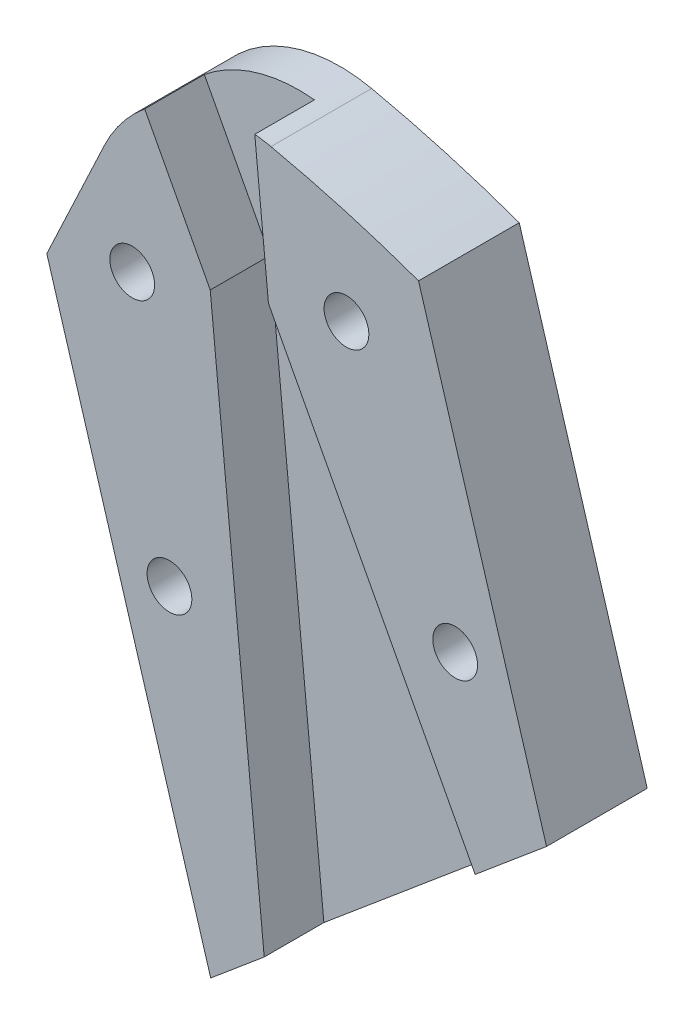
ISO-10303-21;
HEADER;
FILE_DESCRIPTION(('STEP AP214'),'2;1');
FILE_NAME('part.step','',(''),(''),'','','');
FILE_SCHEMA(('AUTOMOTIVE_DESIGN { 1 0 10303 214 1 1 1 1 }'));
ENDSEC;
DATA;
#1=APPLICATION_CONTEXT('core data for automotive mechanical design processes');
#2=APPLICATION_PROTOCOL_DEFINITION('international standard','automotive_design',2000,#1);
#3=PRODUCT_CONTEXT('',#1,'mechanical');
#4=PRODUCT('Part','Part','',(#3));
#5=PRODUCT_RELATED_PRODUCT_CATEGORY('part','',(#4));
#6=PRODUCT_DEFINITION_FORMATION('','',#4);
#7=PRODUCT_DEFINITION_CONTEXT('part definition',#1,'design');
#8=PRODUCT_DEFINITION('design','',#6,#7);
#9=PRODUCT_DEFINITION_SHAPE('','',#8);
#10=(LENGTH_UNIT() NAMED_UNIT(*) SI_UNIT(.MILLI.,.METRE.));
#11=(NAMED_UNIT(*) PLANE_ANGLE_UNIT() SI_UNIT($,.RADIAN.));
#12=(NAMED_UNIT(*) SI_UNIT($,.STERADIAN.) SOLID_ANGLE_UNIT());
#13=UNCERTAINTY_MEASURE_WITH_UNIT(LENGTH_MEASURE(1.E-05),#10,'distance_accuracy_value','');
#14=(GEOMETRIC_REPRESENTATION_CONTEXT(3) GLOBAL_UNCERTAINTY_ASSIGNED_CONTEXT((#13)) GLOBAL_UNIT_ASSIGNED_CONTEXT((#10,
#11,#12)) REPRESENTATION_CONTEXT('',''));
#15=CARTESIAN_POINT('',(0.,0.,0.));
#16=DIRECTION('',(0.,0.,1.));
#17=DIRECTION('',(1.,0.,0.));
#18=AXIS2_PLACEMENT_3D('',#15,#16,#17);
#19=CARTESIAN_POINT('',(-74.1892847970259,-68.5571228840362,-27.5));
#20=DIRECTION('',(0.,0.,1.));
#21=DIRECTION('',(-1.,0.,0.));
#22=AXIS2_PLACEMENT_3D('',#19,#20,#21);
#23=PLANE('',#22);
#24=CARTESIAN_POINT('',(-101.219347978572,42.2429052887889,-27.5));
#25=DIRECTION('',(0.,0.,-1.));
#26=DIRECTION('',(-1.,0.,0.));
#27=AXIS2_PLACEMENT_3D('',#24,#25,#26);
#28=CIRCLE('',#27,1.5);
#29=CARTESIAN_POINT('',(-102.719347978572,42.2429052887889,-27.5));
#30=VERTEX_POINT('',#29);
#31=EDGE_CURVE('E198',#30,#30,#28,.F.);
#32=ORIENTED_EDGE('',*,*,#31,.F.);
#33=EDGE_LOOP('',(#32));
#34=FACE_BOUND('',#33,.T.);
#35=DIRECTION('',(0.0975753561358641,-0.995228139611697,0.));
#36=VECTOR('',#35,1.);
#37=CARTESIAN_POINT('',(-90.8199749610443,-8.90428138871929,-27.5));
#38=LINE('',#37,#36);
#39=CARTESIAN_POINT('',(-95.9887125382994,43.814696915495,-27.5));
#40=VERTEX_POINT('',#39);
#41=CARTESIAN_POINT('',(-92.3690173131185,6.89530776254084,-27.5));
#42=VERTEX_POINT('',#41);
#43=EDGE_CURVE('E163',#40,#42,#38,.T.);
#44=ORIENTED_EDGE('',*,*,#43,.F.);
#45=DIRECTION('',(0.46717680987291,-0.884163914846659,0.));
#46=VECTOR('',#45,1.);
#47=CARTESIAN_POINT('',(-56.9406384526719,-30.0864414140442,-27.5));
#48=LINE('',#47,#46);
#49=CARTESIAN_POINT('',(-100.382341665289,52.1299391261703,-27.5));
#50=VERTEX_POINT('',#49);
#51=EDGE_CURVE('E42',#50,#40,#48,.T.);
#52=ORIENTED_EDGE('',*,*,#51,.F.);
#53=CARTESIAN_POINT('',(-94.0366346201967,44.4012909844925,-27.5));
#54=DIRECTION('',(0.,0.,-1.));
#55=DIRECTION('',(-1.,0.,0.));
#56=AXIS2_PLACEMENT_3D('',#53,#54,#55);
#57=CIRCLE('',#56,9.99999999999999);
#58=CARTESIAN_POINT('',(-103.085929893281,48.6569055183213,-27.5));
#59=VERTEX_POINT('',#58);
#60=EDGE_CURVE('E150',#59,#50,#57,.T.);
#61=ORIENTED_EDGE('',*,*,#60,.F.);
#62=DIRECTION('',(-0.425561453382882,-0.904929527308425,0.));
#63=VECTOR('',#62,1.);
#64=CARTESIAN_POINT('',(-103.154731418742,48.5106034239492,-27.5));
#65=LINE('',#64,#63);
#66=CARTESIAN_POINT('',(-106.945535827358,40.4496974975837,-27.5));
#67=VERTEX_POINT('',#66);
#68=EDGE_CURVE('E207',#59,#67,#65,.T.);
#69=ORIENTED_EDGE('',*,*,#68,.T.);
#70=DIRECTION('',(-0.287784759427187,0.95769511445002,0.));
#71=VECTOR('',#70,1.);
#72=CARTESIAN_POINT('',(-74.1892847970259,-68.5571228840362,-27.5));
#73=LINE('',#72,#71);
#74=CARTESIAN_POINT('',(-95.9576660688243,3.88407391520334,-27.5));
#75=VERTEX_POINT('',#74);
#76=EDGE_CURVE('E11',#75,#67,#73,.T.);
#77=ORIENTED_EDGE('',*,*,#76,.F.);
#78=DIRECTION('',(-0.766044443118982,-0.642787609686535,0.));
#79=VECTOR('',#78,1.);
#80=CARTESIAN_POINT('',(-41.5599291638824,49.5291948890183,-27.5));
#81=LINE('',#80,#79);
#82=EDGE_CURVE('E190',#42,#75,#81,.T.);
#83=ORIENTED_EDGE('',*,*,#82,.F.);
#84=EDGE_LOOP('',(#44,#52,#61,#69,#77,#83));
#85=FACE_BOUND('',#84,.T.);
#86=CARTESIAN_POINT('',(-98.7212448544347,25.2426264445703,-27.5));
#87=DIRECTION('',(0.,0.,-1.));
#88=DIRECTION('',(-1.,0.,0.));
#89=AXIS2_PLACEMENT_3D('',#86,#87,#88);
#90=CIRCLE('',#89,1.5);
#91=CARTESIAN_POINT('',(-100.221244854435,25.2426264445703,-27.5));
#92=VERTEX_POINT('',#91);
#93=EDGE_CURVE('E157',#92,#92,#90,.F.);
#94=ORIENTED_EDGE('',*,*,#93,.F.);
#95=EDGE_LOOP('',(#94));
#96=FACE_BOUND('',#95,.T.);
#97=ADVANCED_FACE('F38',(#34,#85,#96),#23,.T.);
#98=CARTESIAN_POINT('',(-74.1892847970259,-68.5571228840362,-27.5));
#99=DIRECTION('',(-0.95769511445002,-0.287784759427187,0.));
#100=DIRECTION('',(0.287784759427187,-0.95769511445002,0.));
#101=AXIS2_PLACEMENT_3D('',#98,#99,#100);
#102=PLANE('',#101);
#103=ORIENTED_EDGE('',*,*,#76,.T.);
#104=DIRECTION('',(0.,0.,-1.));
#105=VECTOR('',#104,1.);
#106=CARTESIAN_POINT('',(-106.945535827358,40.4496974975837,-34.25));
#107=LINE('',#106,#105);
#108=CARTESIAN_POINT('',(-106.945535827358,40.4496974975837,-34.25));
#109=VERTEX_POINT('',#108);
#110=EDGE_CURVE('E209',#67,#109,#107,.T.);
#111=ORIENTED_EDGE('',*,*,#110,.T.);
#112=DIRECTION('',(0.287784759427187,-0.95769511445002,0.));
#113=VECTOR('',#112,1.);
#114=CARTESIAN_POINT('',(-86.9399558255523,-26.1252186571247,-34.25));
#115=LINE('',#114,#113);
#116=CARTESIAN_POINT('',(-95.9576660688243,3.88407391520334,-34.25));
#117=VERTEX_POINT('',#116);
#118=EDGE_CURVE('E183',#109,#117,#115,.T.);
#119=ORIENTED_EDGE('',*,*,#118,.T.);
#120=DIRECTION('',(0.,0.,-1.));
#121=VECTOR('',#120,1.);
#122=CARTESIAN_POINT('',(-95.9576660688243,3.88407391520334,-34.25));
#123=LINE('',#122,#121);
#124=EDGE_CURVE('E187',#75,#117,#123,.T.);
#125=ORIENTED_EDGE('',*,*,#124,.F.);
#126=EDGE_LOOP('',(#103,#111,#119,#125));
#127=FACE_BOUND('',#126,.T.);
#128=ADVANCED_FACE('F299',(#127),#102,.T.);
#129=CARTESIAN_POINT('',(-79.5673425654343,30.998321633114,-27.5));
#130=DIRECTION('',(0.,0.,-1.));
#131=DIRECTION('',(-1.,0.,0.));
#132=AXIS2_PLACEMENT_3D('',#129,#130,#131);
#133=CIRCLE('',#132,1.5);
#134=CARTESIAN_POINT('',(-81.0673425654343,30.998321633114,-27.5));
#135=VERTEX_POINT('',#134);
#136=EDGE_CURVE('E204',#135,#135,#133,.F.);
#137=ORIENTED_EDGE('',*,*,#136,.F.);
#138=EDGE_LOOP('',(#137));
#139=FACE_BOUND('',#138,.T.);
#140=DIRECTION('',(-0.287784759427187,0.95769511445002,0.));
#141=VECTOR('',#140,1.);
#142=CARTESIAN_POINT('',(-48.3315167068753,-60.7869343795021,-27.5));
#143=LINE('',#142,#141);
#144=CARTESIAN_POINT('',(-73.4421904308482,22.7768012188099,-27.5));
#145=VERTEX_POINT('',#144);
#146=CARTESIAN_POINT('',(-82.0220970357489,51.3291632490509,-27.5));
#147=VERTEX_POINT('',#146);
#148=EDGE_CURVE('E48',#145,#147,#143,.T.);
#149=ORIENTED_EDGE('',*,*,#148,.T.);
#150=CARTESIAN_POINT('',(-108.317782272363,-21.5,-27.5));
#151=DIRECTION('',(0.,0.,-1.));
#152=DIRECTION('',(-1.,0.,0.));
#153=AXIS2_PLACEMENT_3D('',#150,#151,#152);
#154=CIRCLE('',#153,77.4309374967139);
#155=CARTESIAN_POINT('',(-91.9187421242096,54.174444588905,-27.5));
#156=VERTEX_POINT('',#155);
#157=EDGE_CURVE('E164',#156,#147,#154,.T.);
#158=ORIENTED_EDGE('',*,*,#157,.F.);
#159=CARTESIAN_POINT('',(-93.0022176769861,54.3476461755964,-27.5));
#160=VERTEX_POINT('',#159);
#161=EDGE_CURVE('E158',#160,#156,#57,.T.);
#162=ORIENTED_EDGE('',*,*,#161,.F.);
#163=DIRECTION('',(0.0975753561358635,-0.995228139611697,0.));
#164=VECTOR('',#163,1.);
#165=CARTESIAN_POINT('',(-86.8390624025976,-8.51397996417578,-27.5));
#166=LINE('',#165,#164);
#167=CARTESIAN_POINT('',(-92.084556702094,44.9878850534901,-27.5));
#168=VERTEX_POINT('',#167);
#169=EDGE_CURVE('E220',#160,#168,#166,.T.);
#170=ORIENTED_EDGE('',*,*,#169,.T.);
#171=DIRECTION('',(0.46717680987291,-0.884163914846659,0.));
#172=VECTOR('',#171,1.);
#173=CARTESIAN_POINT('',(-53.4039827932852,-28.2177341745526,-27.5));
#174=LINE('',#173,#172);
#175=CARTESIAN_POINT('',(-78.2271294468595,18.7617606552691,-27.5));
#176=VERTEX_POINT('',#175);
#177=EDGE_CURVE('E217',#168,#176,#174,.T.);
#178=ORIENTED_EDGE('',*,*,#177,.T.);
#179=EDGE_CURVE('E193',#145,#176,#81,.T.);
#180=ORIENTED_EDGE('',*,*,#179,.F.);
#181=EDGE_LOOP('',(#149,#158,#162,#170,#178,#180));
#182=FACE_BOUND('',#181,.T.);
#183=CARTESIAN_POINT('',(-86.8539212618216,46.5596766801966,-27.5));
#184=DIRECTION('',(0.,0.,-1.));
#185=DIRECTION('',(-1.,0.,0.));
#186=AXIS2_PLACEMENT_3D('',#183,#184,#185);
#187=CIRCLE('',#186,1.5);
#188=CARTESIAN_POINT('',(-88.3539212618216,46.5596766801966,-27.5));
#189=VERTEX_POINT('',#188);
#190=EDGE_CURVE('E201',#189,#189,#187,.F.);
#191=ORIENTED_EDGE('',*,*,#190,.F.);
#192=EDGE_LOOP('',(#191));
#193=FACE_BOUND('',#192,.T.);
#194=ADVANCED_FACE('F302',(#139,#182,#193),#23,.T.);
#195=CARTESIAN_POINT('',(-48.3315167068753,-60.7869343795021,-27.5));
#196=DIRECTION('',(0.95769511445002,0.287784759427187,0.));
#197=DIRECTION('',(-0.287784759427187,0.95769511445002,0.));
#198=AXIS2_PLACEMENT_3D('',#195,#196,#197);
#199=PLANE('',#198);
#200=DIRECTION('',(-0.287784759427187,0.95769511445002,0.));
#201=VECTOR('',#200,1.);
#202=CARTESIAN_POINT('',(-61.0821877354018,-18.3550301525907,-34.25));
#203=LINE('',#202,#201);
#204=CARTESIAN_POINT('',(-73.4421904308482,22.7768012188099,-34.25));
#205=VERTEX_POINT('',#204);
#206=CARTESIAN_POINT('',(-82.0220970357489,51.329163249051,-34.25));
#207=VERTEX_POINT('',#206);
#208=EDGE_CURVE('E212',#205,#207,#203,.T.);
#209=ORIENTED_EDGE('',*,*,#208,.T.);
#210=DIRECTION('',(0.,0.,1.));
#211=VECTOR('',#210,1.);
#212=CARTESIAN_POINT('',(-82.0220970357489,51.3291632490509,-34.25));
#213=LINE('',#212,#211);
#214=EDGE_CURVE('E168',#147,#207,#213,.F.);
#215=ORIENTED_EDGE('',*,*,#214,.F.);
#216=ORIENTED_EDGE('',*,*,#148,.F.);
#217=DIRECTION('',(0.,0.,1.));
#218=VECTOR('',#217,1.);
#219=CARTESIAN_POINT('',(-73.4421904308482,22.7768012188099,-34.25));
#220=LINE('',#219,#218);
#221=EDGE_CURVE('E194',#205,#145,#220,.T.);
#222=ORIENTED_EDGE('',*,*,#221,.F.);
#223=EDGE_LOOP('',(#209,#215,#216,#222));
#224=FACE_BOUND('',#223,.T.);
#225=ADVANCED_FACE('F311',(#224),#199,.T.);
#226=CARTESIAN_POINT('',(-86.8539212618216,46.5596766801966,-32.25));
#227=DIRECTION('',(0.,0.,-1.));
#228=DIRECTION('',(1.,0.,0.));
#229=AXIS2_PLACEMENT_3D('',#226,#227,#228);
#230=PLANE('',#229);
#231=CARTESIAN_POINT('',(-86.8539212618216,46.5596766801966,-32.25));
#232=DIRECTION('',(0.,0.,1.));
#233=DIRECTION('',(1.,0.,0.));
#234=AXIS2_PLACEMENT_3D('',#231,#232,#233);
#235=CIRCLE('',#234,3.00000000000001);
#236=CARTESIAN_POINT('',(-83.8539212618216,46.5596766801966,-32.25));
#237=VERTEX_POINT('',#236);
#238=EDGE_CURVE('E244',#237,#237,#235,.T.);
#239=ORIENTED_EDGE('',*,*,#238,.F.);
#240=EDGE_LOOP('',(#239));
#241=FACE_BOUND('',#240,.T.);
#242=CARTESIAN_POINT('',(-86.8539212618216,46.5596766801966,-32.25));
#243=DIRECTION('',(0.,0.,1.));
#244=DIRECTION('',(1.,0.,0.));
#245=AXIS2_PLACEMENT_3D('',#242,#243,#244);
#246=CIRCLE('',#245,1.5);
#247=CARTESIAN_POINT('',(-85.3539212618216,46.5596766801966,-32.25));
#248=VERTEX_POINT('',#247);
#249=EDGE_CURVE('E272',#248,#248,#246,.F.);
#250=ORIENTED_EDGE('',*,*,#249,.F.);
#251=EDGE_LOOP('',(#250));
#252=FACE_BOUND('',#251,.T.);
#253=ADVANCED_FACE('F292',(#241,#252),#230,.T.);
#254=CARTESIAN_POINT('',(-86.8539212618216,46.5596766801966,-24.75));
#255=DIRECTION('',(0.,0.,-1.));
#256=DIRECTION('',(1.,0.,0.));
#257=AXIS2_PLACEMENT_3D('',#254,#255,#256);
#258=CYLINDRICAL_SURFACE('',#257,1.5);
#259=ORIENTED_EDGE('',*,*,#249,.T.);
#260=EDGE_LOOP('',(#259));
#261=FACE_BOUND('',#260,.T.);
#262=ORIENTED_EDGE('',*,*,#190,.T.);
#263=EDGE_LOOP('',(#262));
#264=FACE_BOUND('',#263,.T.);
#265=ADVANCED_FACE('F283',(#261,#264),#258,.F.);
#266=CARTESIAN_POINT('',(-79.5673425654343,30.998321633114,-32.25));
#267=DIRECTION('',(0.,0.,-1.));
#268=DIRECTION('',(1.,0.,0.));
#269=AXIS2_PLACEMENT_3D('',#266,#267,#268);
#270=PLANE('',#269);
#271=CARTESIAN_POINT('',(-79.5673425654343,30.998321633114,-32.25));
#272=DIRECTION('',(0.,0.,1.));
#273=DIRECTION('',(1.,0.,0.));
#274=AXIS2_PLACEMENT_3D('',#271,#272,#273);
#275=CIRCLE('',#274,3.00000000000001);
#276=CARTESIAN_POINT('',(-76.5673425654343,30.998321633114,-32.25));
#277=VERTEX_POINT('',#276);
#278=EDGE_CURVE('E226',#277,#277,#275,.T.);
#279=ORIENTED_EDGE('',*,*,#278,.F.);
#280=EDGE_LOOP('',(#279));
#281=FACE_BOUND('',#280,.T.);
#282=CARTESIAN_POINT('',(-79.5673425654343,30.998321633114,-32.25));
#283=DIRECTION('',(0.,0.,1.));
#284=DIRECTION('',(1.,0.,0.));
#285=AXIS2_PLACEMENT_3D('',#282,#283,#284);
#286=CIRCLE('',#285,1.5);
#287=CARTESIAN_POINT('',(-78.0673425654343,30.998321633114,-32.25));
#288=VERTEX_POINT('',#287);
#289=EDGE_CURVE('E251',#288,#288,#286,.F.);
#290=ORIENTED_EDGE('',*,*,#289,.F.);
#291=EDGE_LOOP('',(#290));
#292=FACE_BOUND('',#291,.T.);
#293=ADVANCED_FACE('F281',(#281,#292),#270,.T.);
#294=CARTESIAN_POINT('',(-79.5673425654343,30.998321633114,-24.75));
#295=DIRECTION('',(0.,0.,-1.));
#296=DIRECTION('',(1.,0.,0.));
#297=AXIS2_PLACEMENT_3D('',#294,#295,#296);
#298=CYLINDRICAL_SURFACE('',#297,1.5);
#299=ORIENTED_EDGE('',*,*,#289,.T.);
#300=EDGE_LOOP('',(#299));
#301=FACE_BOUND('',#300,.T.);
#302=ORIENTED_EDGE('',*,*,#136,.T.);
#303=EDGE_LOOP('',(#302));
#304=FACE_BOUND('',#303,.T.);
#305=ADVANCED_FACE('F278',(#301,#304),#298,.F.);
#306=CARTESIAN_POINT('',(-98.7212448544347,25.2426264445703,-32.25));
#307=DIRECTION('',(0.,0.,-1.));
#308=DIRECTION('',(1.,0.,0.));
#309=AXIS2_PLACEMENT_3D('',#306,#307,#308);
#310=PLANE('',#309);
#311=CARTESIAN_POINT('',(-98.7212448544347,25.2426264445703,-32.25));
#312=DIRECTION('',(0.,0.,1.));
#313=DIRECTION('',(1.,0.,0.));
#314=AXIS2_PLACEMENT_3D('',#311,#312,#313);
#315=CIRCLE('',#314,3.00000000000001);
#316=CARTESIAN_POINT('',(-95.7212448544347,25.2426264445703,-32.25));
#317=VERTEX_POINT('',#316);
#318=EDGE_CURVE('E233',#317,#317,#315,.T.);
#319=ORIENTED_EDGE('',*,*,#318,.F.);
#320=EDGE_LOOP('',(#319));
#321=FACE_BOUND('',#320,.T.);
#322=CARTESIAN_POINT('',(-98.7212448544347,25.2426264445703,-32.25));
#323=DIRECTION('',(0.,0.,1.));
#324=DIRECTION('',(1.,0.,0.));
#325=AXIS2_PLACEMENT_3D('',#322,#323,#324);
#326=CIRCLE('',#325,1.5);
#327=CARTESIAN_POINT('',(-97.2212448544347,25.2426264445703,-32.25));
#328=VERTEX_POINT('',#327);
#329=EDGE_CURVE('E247',#328,#328,#326,.F.);
#330=ORIENTED_EDGE('',*,*,#329,.F.);
#331=EDGE_LOOP('',(#330));
#332=FACE_BOUND('',#331,.T.);
#333=ADVANCED_FACE('F290',(#321,#332),#310,.T.);
#334=CARTESIAN_POINT('',(-98.7212448544347,25.2426264445703,-24.75));
#335=DIRECTION('',(0.,0.,-1.));
#336=DIRECTION('',(1.,0.,0.));
#337=AXIS2_PLACEMENT_3D('',#334,#335,#336);
#338=CYLINDRICAL_SURFACE('',#337,1.5);
#339=ORIENTED_EDGE('',*,*,#329,.T.);
#340=EDGE_LOOP('',(#339));
#341=FACE_BOUND('',#340,.T.);
#342=ORIENTED_EDGE('',*,*,#93,.T.);
#343=EDGE_LOOP('',(#342));
#344=FACE_BOUND('',#343,.T.);
#345=ADVANCED_FACE('F364',(#341,#344),#338,.F.);
#346=CARTESIAN_POINT('',(-101.219347978572,42.2429052887889,-32.25));
#347=DIRECTION('',(0.,0.,-1.));
#348=DIRECTION('',(1.,0.,0.));
#349=AXIS2_PLACEMENT_3D('',#346,#347,#348);
#350=PLANE('',#349);
#351=CARTESIAN_POINT('',(-101.219347978572,42.2429052887889,-32.25));
#352=DIRECTION('',(0.,0.,1.));
#353=DIRECTION('',(1.,0.,0.));
#354=AXIS2_PLACEMENT_3D('',#351,#352,#353);
#355=CIRCLE('',#354,3.00000000000001);
#356=CARTESIAN_POINT('',(-98.2193479785719,42.2429052887889,-32.25));
#357=VERTEX_POINT('',#356);
#358=EDGE_CURVE('E239',#357,#357,#355,.T.);
#359=ORIENTED_EDGE('',*,*,#358,.F.);
#360=EDGE_LOOP('',(#359));
#361=FACE_BOUND('',#360,.T.);
#362=CARTESIAN_POINT('',(-101.219347978572,42.2429052887889,-32.25));
#363=DIRECTION('',(0.,0.,1.));
#364=DIRECTION('',(1.,0.,0.));
#365=AXIS2_PLACEMENT_3D('',#362,#363,#364);
#366=CIRCLE('',#365,1.5);
#367=CARTESIAN_POINT('',(-99.7193479785719,42.2429052887889,-32.25));
#368=VERTEX_POINT('',#367);
#369=EDGE_CURVE('E269',#368,#368,#366,.F.);
#370=ORIENTED_EDGE('',*,*,#369,.F.);
#371=EDGE_LOOP('',(#370));
#372=FACE_BOUND('',#371,.T.);
#373=ADVANCED_FACE('F360',(#361,#372),#350,.T.);
#374=CARTESIAN_POINT('',(-101.219347978572,42.2429052887889,-24.75));
#375=DIRECTION('',(0.,0.,-1.));
#376=DIRECTION('',(1.,0.,0.));
#377=AXIS2_PLACEMENT_3D('',#374,#375,#376);
#378=CYLINDRICAL_SURFACE('',#377,1.5);
#379=ORIENTED_EDGE('',*,*,#369,.T.);
#380=EDGE_LOOP('',(#379));
#381=FACE_BOUND('',#380,.T.);
#382=ORIENTED_EDGE('',*,*,#31,.T.);
#383=EDGE_LOOP('',(#382));
#384=FACE_BOUND('',#383,.T.);
#385=ADVANCED_FACE('F363',(#381,#384),#378,.F.);
#386=CARTESIAN_POINT('',(-103.154731418742,48.5106034239492,-34.25));
#387=DIRECTION('',(-0.904929527308425,0.425561453382882,0.));
#388=DIRECTION('',(-0.425561453382882,-0.904929527308425,0.));
#389=AXIS2_PLACEMENT_3D('',#386,#387,#388);
#390=PLANE('',#389);
#391=DIRECTION('',(0.,0.,1.));
#392=VECTOR('',#391,1.);
#393=CARTESIAN_POINT('',(-103.085929893281,48.6569055183213,-34.25));
#394=LINE('',#393,#392);
#395=CARTESIAN_POINT('',(-103.085929893281,48.6569055183213,-34.25));
#396=VERTEX_POINT('',#395);
#397=EDGE_CURVE('E153',#396,#59,#394,.T.);
#398=ORIENTED_EDGE('',*,*,#397,.F.);
#399=DIRECTION('',(0.425561453382882,0.904929527308425,0.));
#400=VECTOR('',#399,1.);
#401=CARTESIAN_POINT('',(-103.154731418742,48.5106034239492,-34.25));
#402=LINE('',#401,#400);
#403=EDGE_CURVE('E176',#109,#396,#402,.T.);
#404=ORIENTED_EDGE('',*,*,#403,.F.);
#405=ORIENTED_EDGE('',*,*,#110,.F.);
#406=ORIENTED_EDGE('',*,*,#68,.F.);
#407=EDGE_LOOP('',(#398,#404,#405,#406));
#408=FACE_BOUND('',#407,.T.);
#409=ADVANCED_FACE('F40',(#408),#390,.T.);
#410=CARTESIAN_POINT('',(-108.317782272363,-21.5,-34.25));
#411=DIRECTION('',(0.,0.,1.));
#412=DIRECTION('',(-1.,0.,0.));
#413=AXIS2_PLACEMENT_3D('',#410,#411,#412);
#414=CYLINDRICAL_SURFACE('',#413,77.4309374967139);
#415=ORIENTED_EDGE('',*,*,#214,.T.);
#416=CARTESIAN_POINT('',(-108.317782272363,-21.5,-34.25));
#417=DIRECTION('',(0.,0.,1.));
#418=DIRECTION('',(1.,0.,0.));
#419=AXIS2_PLACEMENT_3D('',#416,#417,#418);
#420=CIRCLE('',#419,77.4309374967139);
#421=CARTESIAN_POINT('',(-91.9187421242096,54.174444588905,-34.25));
#422=VERTEX_POINT('',#421);
#423=EDGE_CURVE('E171',#207,#422,#420,.T.);
#424=ORIENTED_EDGE('',*,*,#423,.T.);
#425=DIRECTION('',(0.,0.,1.));
#426=VECTOR('',#425,1.);
#427=CARTESIAN_POINT('',(-91.9187421242096,54.174444588905,-34.25));
#428=LINE('',#427,#426);
#429=EDGE_CURVE('E182',#422,#156,#428,.T.);
#430=ORIENTED_EDGE('',*,*,#429,.T.);
#431=ORIENTED_EDGE('',*,*,#157,.T.);
#432=EDGE_LOOP('',(#415,#424,#430,#431));
#433=FACE_BOUND('',#432,.T.);
#434=ADVANCED_FACE('F329',(#433),#414,.T.);
#435=CARTESIAN_POINT('',(-94.0366346201967,44.4012909844925,-34.25));
#436=DIRECTION('',(0.,0.,1.));
#437=DIRECTION('',(-1.,0.,0.));
#438=AXIS2_PLACEMENT_3D('',#435,#436,#437);
#439=CYLINDRICAL_SURFACE('',#438,9.99999999999999);
#440=ORIENTED_EDGE('',*,*,#60,.T.);
#441=DIRECTION('',(0.,0.,-1.));
#442=VECTOR('',#441,1.);
#443=CARTESIAN_POINT('',(-100.382341665289,52.1299391261703,-27.5));
#444=LINE('',#443,#442);
#445=CARTESIAN_POINT('',(-100.382341665289,52.1299391261703,-31.5));
#446=VERTEX_POINT('',#445);
#447=EDGE_CURVE('E139',#50,#446,#444,.T.);
#448=ORIENTED_EDGE('',*,*,#447,.T.);
#449=CARTESIAN_POINT('',(-94.0366346201967,44.4012909844925,-31.5));
#450=DIRECTION('',(0.,0.,1.));
#451=DIRECTION('',(1.,0.,0.));
#452=AXIS2_PLACEMENT_3D('',#449,#450,#451);
#453=CIRCLE('',#452,9.99999999999998);
#454=CARTESIAN_POINT('',(-93.0022176769861,54.3476461755964,-31.5));
#455=VERTEX_POINT('',#454);
#456=EDGE_CURVE('E252',#455,#446,#453,.T.);
#457=ORIENTED_EDGE('',*,*,#456,.F.);
#458=DIRECTION('',(0.,0.,-1.));
#459=VECTOR('',#458,1.);
#460=CARTESIAN_POINT('',(-93.0022176769861,54.3476461755964,-27.5));
#461=LINE('',#460,#459);
#462=EDGE_CURVE('E80',#160,#455,#461,.T.);
#463=ORIENTED_EDGE('',*,*,#462,.F.);
#464=ORIENTED_EDGE('',*,*,#161,.T.);
#465=ORIENTED_EDGE('',*,*,#429,.F.);
#466=CARTESIAN_POINT('',(-94.0366346201967,44.4012909844925,-34.25));
#467=DIRECTION('',(0.,0.,1.));
#468=DIRECTION('',(1.,0.,0.));
#469=AXIS2_PLACEMENT_3D('',#466,#467,#468);
#470=CIRCLE('',#469,9.99999999999999);
#471=EDGE_CURVE('E175',#422,#396,#470,.T.);
#472=ORIENTED_EDGE('',*,*,#471,.T.);
#473=ORIENTED_EDGE('',*,*,#397,.T.);
#474=EDGE_LOOP('',(#440,#448,#457,#463,#464,#465,#472,#473));
#475=FACE_BOUND('',#474,.T.);
#476=ADVANCED_FACE('F151',(#475),#439,.T.);
#477=CARTESIAN_POINT('',(-56.9406384526719,-30.0864414140442,-27.5));
#478=DIRECTION('',(-0.884163914846659,-0.46717680987291,0.));
#479=DIRECTION('',(0.46717680987291,-0.884163914846659,0.));
#480=AXIS2_PLACEMENT_3D('',#477,#478,#479);
#481=PLANE('',#480);
#482=DIRECTION('',(0.46717680987291,-0.884163914846659,0.));
#483=VECTOR('',#482,1.);
#484=CARTESIAN_POINT('',(-56.9406384526719,-30.0864414140442,-31.5));
#485=LINE('',#484,#483);
#486=CARTESIAN_POINT('',(-95.9887125382994,43.814696915495,-31.5));
#487=VERTEX_POINT('',#486);
#488=EDGE_CURVE('E146',#446,#487,#485,.T.);
#489=ORIENTED_EDGE('',*,*,#488,.F.);
#490=ORIENTED_EDGE('',*,*,#447,.F.);
#491=ORIENTED_EDGE('',*,*,#51,.T.);
#492=DIRECTION('',(0.,0.,-1.));
#493=VECTOR('',#492,1.);
#494=CARTESIAN_POINT('',(-95.9887125382994,43.814696915495,-27.5));
#495=LINE('',#494,#493);
#496=EDGE_CURVE('E147',#40,#487,#495,.T.);
#497=ORIENTED_EDGE('',*,*,#496,.T.);
#498=EDGE_LOOP('',(#489,#490,#491,#497));
#499=FACE_BOUND('',#498,.T.);
#500=ADVANCED_FACE('F141',(#499),#481,.F.);
#501=CARTESIAN_POINT('',(-41.5599291638824,49.5291948890183,-34.25));
#502=DIRECTION('',(-0.642787609686535,0.766044443118982,0.));
#503=DIRECTION('',(-0.766044443118982,-0.642787609686535,0.));
#504=AXIS2_PLACEMENT_3D('',#501,#502,#503);
#505=PLANE('',#504);
#506=ORIENTED_EDGE('',*,*,#221,.T.);
#507=ORIENTED_EDGE('',*,*,#179,.T.);
#508=DIRECTION('',(0.,0.,-1.));
#509=VECTOR('',#508,1.);
#510=CARTESIAN_POINT('',(-78.2271294468595,18.7617606552691,-27.5));
#511=LINE('',#510,#509);
#512=CARTESIAN_POINT('',(-78.2271294468595,18.7617606552691,-31.5));
#513=VERTEX_POINT('',#512);
#514=EDGE_CURVE('E73',#176,#513,#511,.T.);
#515=ORIENTED_EDGE('',*,*,#514,.T.);
#516=DIRECTION('',(0.766044443118982,0.642787609686534,0.));
#517=VECTOR('',#516,1.);
#518=CARTESIAN_POINT('',(-41.5599291638823,49.5291948890183,-31.5));
#519=LINE('',#518,#517);
#520=CARTESIAN_POINT('',(-92.3690173131185,6.89530776254084,-31.5));
#521=VERTEX_POINT('',#520);
#522=EDGE_CURVE('E257',#521,#513,#519,.T.);
#523=ORIENTED_EDGE('',*,*,#522,.F.);
#524=DIRECTION('',(0.,0.,-1.));
#525=VECTOR('',#524,1.);
#526=CARTESIAN_POINT('',(-92.3690173131185,6.89530776254084,-27.5));
#527=LINE('',#526,#525);
#528=EDGE_CURVE('E262',#42,#521,#527,.T.);
#529=ORIENTED_EDGE('',*,*,#528,.F.);
#530=ORIENTED_EDGE('',*,*,#82,.T.);
#531=ORIENTED_EDGE('',*,*,#124,.T.);
#532=DIRECTION('',(0.766044443118982,0.642787609686535,0.));
#533=VECTOR('',#532,1.);
#534=CARTESIAN_POINT('',(-41.5599291638824,49.5291948890183,-34.25));
#535=LINE('',#534,#533);
#536=EDGE_CURVE('E179',#117,#205,#535,.T.);
#537=ORIENTED_EDGE('',*,*,#536,.T.);
#538=EDGE_LOOP('',(#506,#507,#515,#523,#529,#530,#531,#537));
#539=FACE_BOUND('',#538,.T.);
#540=ADVANCED_FACE('F385',(#539),#505,.F.);
#541=CARTESIAN_POINT('',(-86.8390624025976,-8.51397996417578,-27.5));
#542=DIRECTION('',(-0.995228139611697,-0.0975753561358635,0.));
#543=DIRECTION('',(0.0975753561358635,-0.995228139611697,0.));
#544=AXIS2_PLACEMENT_3D('',#541,#542,#543);
#545=PLANE('',#544);
#546=DIRECTION('',(0.0975753561358635,-0.995228139611697,0.));
#547=VECTOR('',#546,1.);
#548=CARTESIAN_POINT('',(-86.8390624025976,-8.51397996417578,-31.5));
#549=LINE('',#548,#547);
#550=CARTESIAN_POINT('',(-92.084556702094,44.9878850534901,-31.5));
#551=VERTEX_POINT('',#550);
#552=EDGE_CURVE('E57',#455,#551,#549,.T.);
#553=ORIENTED_EDGE('',*,*,#552,.T.);
#554=DIRECTION('',(0.,0.,-1.));
#555=VECTOR('',#554,1.);
#556=CARTESIAN_POINT('',(-92.084556702094,44.9878850534901,-27.5));
#557=LINE('',#556,#555);
#558=EDGE_CURVE('E174',#168,#551,#557,.T.);
#559=ORIENTED_EDGE('',*,*,#558,.F.);
#560=ORIENTED_EDGE('',*,*,#169,.F.);
#561=ORIENTED_EDGE('',*,*,#462,.T.);
#562=EDGE_LOOP('',(#553,#559,#560,#561));
#563=FACE_BOUND('',#562,.T.);
#564=ADVANCED_FACE('F332',(#563),#545,.T.);
#565=CARTESIAN_POINT('',(0.,0.,-31.5));
#566=DIRECTION('',(0.,0.,-1.));
#567=DIRECTION('',(1.,0.,0.));
#568=AXIS2_PLACEMENT_3D('',#565,#566,#567);
#569=PLANE('',#568);
#570=ORIENTED_EDGE('',*,*,#552,.F.);
#571=ORIENTED_EDGE('',*,*,#456,.T.);
#572=ORIENTED_EDGE('',*,*,#488,.T.);
#573=DIRECTION('',(0.0975753561358641,-0.995228139611697,0.));
#574=VECTOR('',#573,1.);
#575=CARTESIAN_POINT('',(-90.8199749610443,-8.90428138871929,-31.5));
#576=LINE('',#575,#574);
#577=EDGE_CURVE('E255',#487,#521,#576,.T.);
#578=ORIENTED_EDGE('',*,*,#577,.T.);
#579=ORIENTED_EDGE('',*,*,#522,.T.);
#580=DIRECTION('',(0.46717680987291,-0.884163914846659,0.));
#581=VECTOR('',#580,1.);
#582=CARTESIAN_POINT('',(-53.4039827932852,-28.2177341745526,-31.5));
#583=LINE('',#582,#581);
#584=EDGE_CURVE('E84',#551,#513,#583,.T.);
#585=ORIENTED_EDGE('',*,*,#584,.F.);
#586=EDGE_LOOP('',(#570,#571,#572,#578,#579,#585));
#587=FACE_BOUND('',#586,.T.);
#588=ADVANCED_FACE('F336',(#587),#569,.F.);
#589=CARTESIAN_POINT('',(-53.4039827932852,-28.2177341745526,-27.5));
#590=DIRECTION('',(-0.884163914846659,-0.46717680987291,0.));
#591=DIRECTION('',(0.46717680987291,-0.884163914846659,0.));
#592=AXIS2_PLACEMENT_3D('',#589,#590,#591);
#593=PLANE('',#592);
#594=ORIENTED_EDGE('',*,*,#584,.T.);
#595=ORIENTED_EDGE('',*,*,#514,.F.);
#596=ORIENTED_EDGE('',*,*,#177,.F.);
#597=ORIENTED_EDGE('',*,*,#558,.T.);
#598=EDGE_LOOP('',(#594,#595,#596,#597));
#599=FACE_BOUND('',#598,.T.);
#600=ADVANCED_FACE('F333',(#599),#593,.T.);
#601=CARTESIAN_POINT('',(-90.8199749610443,-8.90428138871929,-27.5));
#602=DIRECTION('',(-0.995228139611697,-0.097575356135864,0.));
#603=DIRECTION('',(0.0975753561358641,-0.995228139611697,0.));
#604=AXIS2_PLACEMENT_3D('',#601,#602,#603);
#605=PLANE('',#604);
#606=ORIENTED_EDGE('',*,*,#577,.F.);
#607=ORIENTED_EDGE('',*,*,#496,.F.);
#608=ORIENTED_EDGE('',*,*,#43,.T.);
#609=ORIENTED_EDGE('',*,*,#528,.T.);
#610=EDGE_LOOP('',(#606,#607,#608,#609));
#611=FACE_BOUND('',#610,.T.);
#612=ADVANCED_FACE('F335',(#611),#605,.F.);
#613=CARTESIAN_POINT('',(-86.8539212618216,46.5596766801966,-32.25));
#614=DIRECTION('',(0.,0.,-1.));
#615=DIRECTION('',(1.,0.,0.));
#616=AXIS2_PLACEMENT_3D('',#613,#614,#615);
#617=CYLINDRICAL_SURFACE('',#616,3.00000000000001);
#618=ORIENTED_EDGE('',*,*,#238,.T.);
#619=EDGE_LOOP('',(#618));
#620=FACE_BOUND('',#619,.T.);
#621=CARTESIAN_POINT('',(-86.8539212618216,46.5596766801966,-34.25));
#622=DIRECTION('',(0.,0.,1.));
#623=DIRECTION('',(1.,0.,0.));
#624=AXIS2_PLACEMENT_3D('',#621,#622,#623);
#625=CIRCLE('',#624,3.00000000000001);
#626=CARTESIAN_POINT('',(-83.8539212618216,46.5596766801966,-34.25));
#627=VERTEX_POINT('',#626);
#628=EDGE_CURVE('E230',#627,#627,#625,.T.);
#629=ORIENTED_EDGE('',*,*,#628,.F.);
#630=EDGE_LOOP('',(#629));
#631=FACE_BOUND('',#630,.T.);
#632=ADVANCED_FACE('F342',(#620,#631),#617,.F.);
#633=CARTESIAN_POINT('',(-79.5673425654343,30.998321633114,-32.25));
#634=DIRECTION('',(0.,0.,-1.));
#635=DIRECTION('',(1.,0.,0.));
#636=AXIS2_PLACEMENT_3D('',#633,#634,#635);
#637=CYLINDRICAL_SURFACE('',#636,3.00000000000001);
#638=ORIENTED_EDGE('',*,*,#278,.T.);
#639=EDGE_LOOP('',(#638));
#640=FACE_BOUND('',#639,.T.);
#641=CARTESIAN_POINT('',(-79.5673425654343,30.998321633114,-34.25));
#642=DIRECTION('',(0.,0.,1.));
#643=DIRECTION('',(1.,0.,0.));
#644=AXIS2_PLACEMENT_3D('',#641,#642,#643);
#645=CIRCLE('',#644,3.00000000000001);
#646=CARTESIAN_POINT('',(-76.5673425654343,30.998321633114,-34.25));
#647=VERTEX_POINT('',#646);
#648=EDGE_CURVE('E229',#647,#647,#645,.T.);
#649=ORIENTED_EDGE('',*,*,#648,.F.);
#650=EDGE_LOOP('',(#649));
#651=FACE_BOUND('',#650,.T.);
#652=ADVANCED_FACE('F349',(#640,#651),#637,.F.);
#653=CARTESIAN_POINT('',(-98.7212448544347,25.2426264445703,-32.25));
#654=DIRECTION('',(0.,0.,-1.));
#655=DIRECTION('',(1.,0.,0.));
#656=AXIS2_PLACEMENT_3D('',#653,#654,#655);
#657=CYLINDRICAL_SURFACE('',#656,3.00000000000001);
#658=ORIENTED_EDGE('',*,*,#318,.T.);
#659=EDGE_LOOP('',(#658));
#660=FACE_BOUND('',#659,.T.);
#661=CARTESIAN_POINT('',(-98.7212448544347,25.2426264445703,-34.25));
#662=DIRECTION('',(0.,0.,1.));
#663=DIRECTION('',(1.,0.,0.));
#664=AXIS2_PLACEMENT_3D('',#661,#662,#663);
#665=CIRCLE('',#664,3.00000000000001);
#666=CARTESIAN_POINT('',(-95.7212448544347,25.2426264445703,-34.25));
#667=VERTEX_POINT('',#666);
#668=EDGE_CURVE('E236',#667,#667,#665,.T.);
#669=ORIENTED_EDGE('',*,*,#668,.F.);
#670=EDGE_LOOP('',(#669));
#671=FACE_BOUND('',#670,.T.);
#672=ADVANCED_FACE('F358',(#660,#671),#657,.F.);
#673=CARTESIAN_POINT('',(-101.219347978572,42.2429052887889,-32.25));
#674=DIRECTION('',(0.,0.,-1.));
#675=DIRECTION('',(1.,0.,0.));
#676=AXIS2_PLACEMENT_3D('',#673,#674,#675);
#677=CYLINDRICAL_SURFACE('',#676,3.00000000000001);
#678=ORIENTED_EDGE('',*,*,#358,.T.);
#679=EDGE_LOOP('',(#678));
#680=FACE_BOUND('',#679,.T.);
#681=CARTESIAN_POINT('',(-101.219347978572,42.2429052887889,-34.25));
#682=DIRECTION('',(0.,0.,1.));
#683=DIRECTION('',(1.,0.,0.));
#684=AXIS2_PLACEMENT_3D('',#681,#682,#683);
#685=CIRCLE('',#684,3.00000000000001);
#686=CARTESIAN_POINT('',(-98.2193479785719,42.2429052887889,-34.25));
#687=VERTEX_POINT('',#686);
#688=EDGE_CURVE('E224',#687,#687,#685,.T.);
#689=ORIENTED_EDGE('',*,*,#688,.F.);
#690=EDGE_LOOP('',(#689));
#691=FACE_BOUND('',#690,.T.);
#692=ADVANCED_FACE('F354',(#680,#691),#677,.F.);
#693=CARTESIAN_POINT('',(0.,0.,-34.25));
#694=DIRECTION('',(0.,0.,-1.));
#695=DIRECTION('',(1.,0.,0.));
#696=AXIS2_PLACEMENT_3D('',#693,#694,#695);
#697=PLANE('',#696);
#698=ORIENTED_EDGE('',*,*,#688,.T.);
#699=EDGE_LOOP('',(#698));
#700=FACE_BOUND('',#699,.T.);
#701=ORIENTED_EDGE('',*,*,#668,.T.);
#702=EDGE_LOOP('',(#701));
#703=FACE_BOUND('',#702,.T.);
#704=ORIENTED_EDGE('',*,*,#648,.T.);
#705=EDGE_LOOP('',(#704));
#706=FACE_BOUND('',#705,.T.);
#707=ORIENTED_EDGE('',*,*,#628,.T.);
#708=EDGE_LOOP('',(#707));
#709=FACE_BOUND('',#708,.T.);
#710=ORIENTED_EDGE('',*,*,#536,.F.);
#711=ORIENTED_EDGE('',*,*,#118,.F.);
#712=ORIENTED_EDGE('',*,*,#403,.T.);
#713=ORIENTED_EDGE('',*,*,#471,.F.);
#714=ORIENTED_EDGE('',*,*,#423,.F.);
#715=ORIENTED_EDGE('',*,*,#208,.F.);
#716=EDGE_LOOP('',(#710,#711,#712,#713,#714,#715));
#717=FACE_BOUND('',#716,.T.);
#718=ADVANCED_FACE('F357',(#700,#703,#706,#709,#717),#697,.T.);
#719=CLOSED_SHELL('',(#97,#128,#194,#225,#253,#265,#293,#305,#333,#345,#373,#385,#409,#434,#476,
#500,#540,#564,#588,#600,#612,#632,#652,#672,#692,#718));
#720=MANIFOLD_SOLID_BREP('B2',#719);
#721=ADVANCED_BREP_SHAPE_REPRESENTATION('',(#18,#720),#14);
#722=SHAPE_DEFINITION_REPRESENTATION(#9,#721);
ENDSEC;
END-ISO-10303-21;
